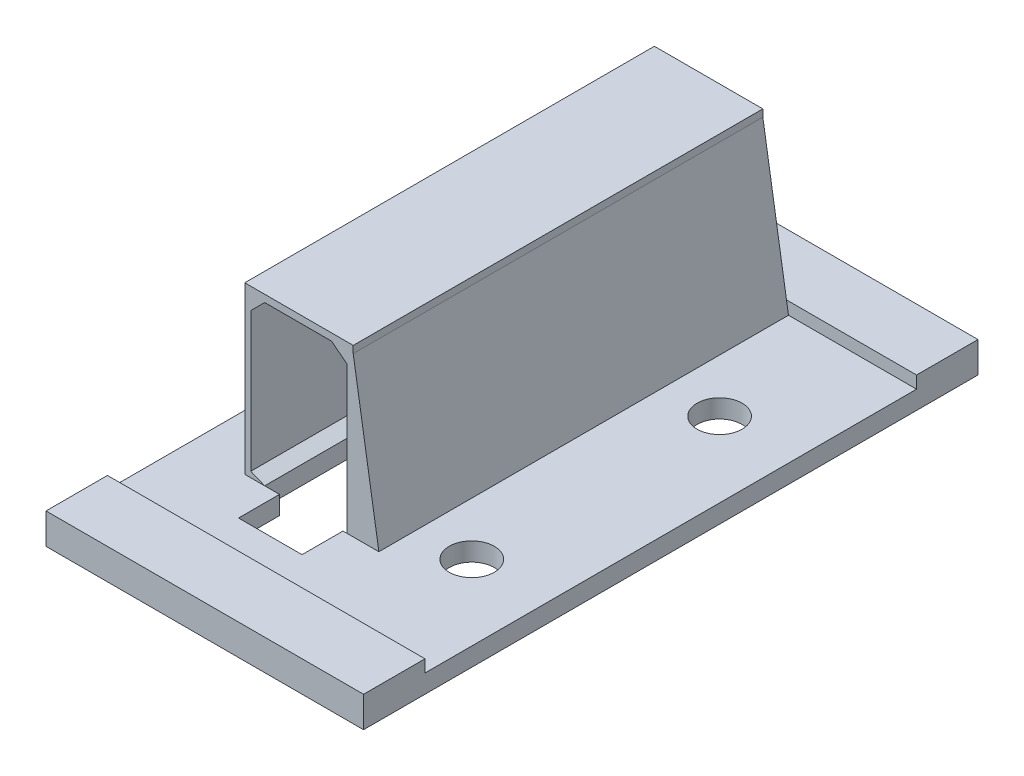
ISO-10303-21;
HEADER;
FILE_DESCRIPTION(('STEP AP214'),'2;1');
FILE_NAME('part.step','',(''),(''),'','','');
FILE_SCHEMA(('AUTOMOTIVE_DESIGN { 1 0 10303 214 1 1 1 1 }'));
ENDSEC;
DATA;
#1=APPLICATION_CONTEXT('core data for automotive mechanical design processes');
#2=APPLICATION_PROTOCOL_DEFINITION('international standard','automotive_design',2000,#1);
#3=PRODUCT_CONTEXT('',#1,'mechanical');
#4=PRODUCT('Part','Part','',(#3));
#5=PRODUCT_RELATED_PRODUCT_CATEGORY('part','',(#4));
#6=PRODUCT_DEFINITION_FORMATION('','',#4);
#7=PRODUCT_DEFINITION_CONTEXT('part definition',#1,'design');
#8=PRODUCT_DEFINITION('design','',#6,#7);
#9=PRODUCT_DEFINITION_SHAPE('','',#8);
#10=(LENGTH_UNIT() NAMED_UNIT(*) SI_UNIT(.MILLI.,.METRE.));
#11=(NAMED_UNIT(*) PLANE_ANGLE_UNIT() SI_UNIT($,.RADIAN.));
#12=(NAMED_UNIT(*) SI_UNIT($,.STERADIAN.) SOLID_ANGLE_UNIT());
#13=UNCERTAINTY_MEASURE_WITH_UNIT(LENGTH_MEASURE(1.E-05),#10,'distance_accuracy_value','');
#14=(GEOMETRIC_REPRESENTATION_CONTEXT(3) GLOBAL_UNCERTAINTY_ASSIGNED_CONTEXT((#13)) GLOBAL_UNIT_ASSIGNED_CONTEXT((#10,
#11,#12)) REPRESENTATION_CONTEXT('',''));
#15=CARTESIAN_POINT('',(0.,0.,0.));
#16=DIRECTION('',(0.,0.,1.));
#17=DIRECTION('',(1.,0.,0.));
#18=AXIS2_PLACEMENT_3D('',#15,#16,#17);
#19=CARTESIAN_POINT('',(17.4571997680022,22.1205755690432,2.75718042597652));
#20=DIRECTION('',(-0.619504091566,-0.784993427063555,0.));
#21=DIRECTION('',(0.784993427063555,-0.619504091566,0.));
#22=AXIS2_PLACEMENT_3D('',#19,#20,#21);
#23=PLANE('',#22);
#24=DIRECTION('',(-0.784993427063555,0.619504091566,0.));
#25=VECTOR('',#24,1.);
#26=CARTESIAN_POINT('',(17.4571997680022,22.1205755690432,-21.59));
#27=LINE('',#26,#25);
#28=CARTESIAN_POINT('',(19.8260707858369,20.2511009500897,-21.59));
#29=VERTEX_POINT('',#28);
#30=CARTESIAN_POINT('',(19.5481129071256,20.4704608035712,-21.59));
#31=VERTEX_POINT('',#30);
#32=EDGE_CURVE('E98',#29,#31,#27,.T.);
#33=ORIENTED_EDGE('',*,*,#32,.T.);
#34=DIRECTION('',(0.,0.,1.));
#35=VECTOR('',#34,1.);
#36=CARTESIAN_POINT('',(19.5481129071256,20.4704608035712,2.75718042597652));
#37=LINE('',#36,#35);
#38=CARTESIAN_POINT('',(19.5481129071256,20.4704608035712,-17.78));
#39=VERTEX_POINT('',#38);
#40=EDGE_CURVE('E102',#31,#39,#37,.T.);
#41=ORIENTED_EDGE('',*,*,#40,.T.);
#42=DIRECTION('',(-0.784993427063555,0.619504091566,0.));
#43=VECTOR('',#42,1.);
#44=CARTESIAN_POINT('',(17.4571997680022,22.1205755690432,-17.78));
#45=LINE('',#44,#43);
#46=CARTESIAN_POINT('',(17.6467317503519,21.971,-17.78));
#47=VERTEX_POINT('',#46);
#48=EDGE_CURVE('E332',#39,#47,#45,.T.);
#49=ORIENTED_EDGE('',*,*,#48,.T.);
#50=DIRECTION('',(0.,0.,-1.));
#51=VECTOR('',#50,1.);
#52=CARTESIAN_POINT('',(17.6467317503519,21.971,2.75718042597652));
#53=LINE('',#52,#51);
#54=CARTESIAN_POINT('',(17.6467317503519,21.971,-67.818));
#55=VERTEX_POINT('',#54);
#56=EDGE_CURVE('E331',#47,#55,#53,.T.);
#57=ORIENTED_EDGE('',*,*,#56,.T.);
#58=DIRECTION('',(0.784993427063555,-0.619504091566,0.));
#59=VECTOR('',#58,1.);
#60=CARTESIAN_POINT('',(17.4571997680022,22.1205755690432,-67.818));
#61=LINE('',#60,#59);
#62=CARTESIAN_POINT('',(19.8260707858369,20.2511009500897,-67.818));
#63=VERTEX_POINT('',#62);
#64=EDGE_CURVE('E345',#55,#63,#61,.T.);
#65=ORIENTED_EDGE('',*,*,#64,.T.);
#66=DIRECTION('',(0.,0.,-1.));
#67=VECTOR('',#66,1.);
#68=CARTESIAN_POINT('',(19.8260707858369,20.2511009500897,2.75718042597652));
#69=LINE('',#68,#67);
#70=EDGE_CURVE('E340',#29,#63,#69,.T.);
#71=ORIENTED_EDGE('',*,*,#70,.F.);
#72=EDGE_LOOP('',(#33,#41,#49,#57,#65,#71));
#73=FACE_BOUND('',#72,.T.);
#74=ADVANCED_FACE('F83',(#73),#23,.T.);
#75=CARTESIAN_POINT('',(1.99059559761719,-4.87832590559546,2.75718042597652));
#76=DIRECTION('',(0.377806240827101,-0.925884682016122,0.));
#77=DIRECTION('',(0.925884682016122,0.377806240827101,0.));
#78=AXIS2_PLACEMENT_3D('',#75,#76,#77);
#79=PLANE('',#78);
#80=DIRECTION('',(-0.925884682016122,-0.377806240827101,0.));
#81=VECTOR('',#80,1.);
#82=CARTESIAN_POINT('',(1.99059559761719,-4.87832590559546,-21.59));
#83=LINE('',#82,#81);
#84=CARTESIAN_POINT('',(22.5326450406693,3.50383510182555,-21.59));
#85=VERTEX_POINT('',#84);
#86=CARTESIAN_POINT('',(19.5481129071256,2.286,-21.59));
#87=VERTEX_POINT('',#86);
#88=EDGE_CURVE('E322',#85,#87,#83,.T.);
#89=ORIENTED_EDGE('',*,*,#88,.F.);
#90=DIRECTION('',(0.,0.,-1.));
#91=VECTOR('',#90,1.);
#92=CARTESIAN_POINT('',(22.5326450406693,3.50383510182555,2.75718042597652));
#93=LINE('',#92,#91);
#94=CARTESIAN_POINT('',(22.5326450406693,3.50383510182555,-67.818));
#95=VERTEX_POINT('',#94);
#96=EDGE_CURVE('E338',#85,#95,#93,.T.);
#97=ORIENTED_EDGE('',*,*,#96,.T.);
#98=DIRECTION('',(0.925884682016122,0.377806240827101,0.));
#99=VECTOR('',#98,1.);
#100=CARTESIAN_POINT('',(1.99059559761719,-4.87832590559546,-67.818));
#101=LINE('',#100,#99);
#102=CARTESIAN_POINT('',(19.5481129071256,2.286,-67.818));
#103=VERTEX_POINT('',#102);
#104=EDGE_CURVE('E348',#103,#95,#101,.T.);
#105=ORIENTED_EDGE('',*,*,#104,.F.);
#106=DIRECTION('',(0.,0.,-1.));
#107=VECTOR('',#106,1.);
#108=CARTESIAN_POINT('',(19.5481129071256,2.286,2.75718042597652));
#109=LINE('',#108,#107);
#110=EDGE_CURVE('E282',#87,#103,#109,.T.);
#111=ORIENTED_EDGE('',*,*,#110,.F.);
#112=EDGE_LOOP('',(#89,#97,#105,#111));
#113=FACE_BOUND('',#112,.T.);
#114=ADVANCED_FACE('F620',(#113),#79,.F.);
#115=CARTESIAN_POINT('',(22.5109525024363,3.63806038829697,2.75718042597652));
#116=DIRECTION('',(-0.987191011527884,-0.159542805411442,0.));
#117=DIRECTION('',(0.159542805411442,-0.987191011527884,0.));
#118=AXIS2_PLACEMENT_3D('',#115,#116,#117);
#119=PLANE('',#118);
#120=ORIENTED_EDGE('',*,*,#96,.F.);
#121=DIRECTION('',(-0.159542805411442,0.987191011527884,0.));
#122=VECTOR('',#121,1.);
#123=CARTESIAN_POINT('',(22.5109525024363,3.63806038829697,-21.59));
#124=LINE('',#123,#122);
#125=EDGE_CURVE('E91',#85,#29,#124,.T.);
#126=ORIENTED_EDGE('',*,*,#125,.T.);
#127=ORIENTED_EDGE('',*,*,#70,.T.);
#128=DIRECTION('',(-0.159542805411442,0.987191011527884,0.));
#129=VECTOR('',#128,1.);
#130=CARTESIAN_POINT('',(22.5109525024363,3.63806038829697,-67.818));
#131=LINE('',#130,#129);
#132=EDGE_CURVE('E369',#95,#63,#131,.T.);
#133=ORIENTED_EDGE('',*,*,#132,.F.);
#134=EDGE_LOOP('',(#120,#126,#127,#133));
#135=FACE_BOUND('',#134,.T.);
#136=ADVANCED_FACE('F473',(#135),#119,.T.);
#137=CARTESIAN_POINT('',(0.,0.,-67.818));
#138=DIRECTION('',(0.,0.,1.));
#139=DIRECTION('',(1.,0.,0.));
#140=AXIS2_PLACEMENT_3D('',#137,#138,#139);
#141=PLANE('',#140);
#142=ORIENTED_EDGE('',*,*,#64,.F.);
#143=DIRECTION('',(-1.,0.,0.));
#144=VECTOR('',#143,1.);
#145=CARTESIAN_POINT('',(0.,21.971,-67.818));
#146=LINE('',#145,#144);
#147=CARTESIAN_POINT('',(9.33989904991033,21.971,-67.818));
#148=VERTEX_POINT('',#147);
#149=EDGE_CURVE('E372',#55,#148,#146,.T.);
#150=ORIENTED_EDGE('',*,*,#149,.T.);
#151=DIRECTION('',(-0.707106781186547,-0.707106781186548,0.));
#152=VECTOR('',#151,1.);
#153=CARTESIAN_POINT('',(-6.31555047504482,6.3155504750448,-67.818));
#154=LINE('',#153,#152);
#155=CARTESIAN_POINT('',(7.62,20.2511009500897,-67.818));
#156=VERTEX_POINT('',#155);
#157=EDGE_CURVE('E467',#148,#156,#154,.T.);
#158=ORIENTED_EDGE('',*,*,#157,.T.);
#159=DIRECTION('',(0.,-1.,0.));
#160=VECTOR('',#159,1.);
#161=CARTESIAN_POINT('',(7.62,0.,-67.818));
#162=LINE('',#161,#160);
#163=CARTESIAN_POINT('',(7.62,2.98989904991031,-67.818));
#164=VERTEX_POINT('',#163);
#165=EDGE_CURVE('E374',#156,#164,#162,.T.);
#166=ORIENTED_EDGE('',*,*,#165,.T.);
#167=DIRECTION('',(0.925489621647092,-0.378772966595456,0.));
#168=VECTOR('',#167,1.);
#169=CARTESIAN_POINT('',(2.1413439329422,5.23213576757605,-67.818));
#170=LINE('',#169,#168);
#171=CARTESIAN_POINT('',(9.33989904991033,2.286,-67.818));
#172=VERTEX_POINT('',#171);
#173=EDGE_CURVE('E354',#164,#172,#170,.T.);
#174=ORIENTED_EDGE('',*,*,#173,.T.);
#175=DIRECTION('',(0.,1.,0.));
#176=VECTOR('',#175,1.);
#177=CARTESIAN_POINT('',(9.33989904991033,0.,-67.818));
#178=LINE('',#177,#176);
#179=CARTESIAN_POINT('',(9.33989904991033,0.,-67.818));
#180=VERTEX_POINT('',#179);
#181=EDGE_CURVE('E286',#180,#172,#178,.T.);
#182=ORIENTED_EDGE('',*,*,#181,.F.);
#183=DIRECTION('',(-1.,0.,0.));
#184=VECTOR('',#183,1.);
#185=CARTESIAN_POINT('',(19.5481129071256,0.,-67.818));
#186=LINE('',#185,#184);
#187=CARTESIAN_POINT('',(19.5481129071256,0.,-67.818));
#188=VERTEX_POINT('',#187);
#189=EDGE_CURVE('E290',#188,#180,#186,.T.);
#190=ORIENTED_EDGE('',*,*,#189,.F.);
#191=DIRECTION('',(0.,1.,0.));
#192=VECTOR('',#191,1.);
#193=CARTESIAN_POINT('',(19.5481129071256,0.,-67.818));
#194=LINE('',#193,#192);
#195=EDGE_CURVE('E275',#188,#103,#194,.T.);
#196=ORIENTED_EDGE('',*,*,#195,.T.);
#197=ORIENTED_EDGE('',*,*,#104,.T.);
#198=ORIENTED_EDGE('',*,*,#132,.T.);
#199=EDGE_LOOP('',(#142,#150,#158,#166,#174,#182,#190,#196,#197,#198));
#200=FACE_BOUND('',#199,.T.);
#201=ADVANCED_FACE('F291',(#200),#141,.T.);
#202=CARTESIAN_POINT('',(0.,2.286,0.));
#203=DIRECTION('',(0.,1.,0.));
#204=DIRECTION('',(0.,0.,1.));
#205=AXIS2_PLACEMENT_3D('',#202,#203,#204);
#206=PLANE('',#205);
#207=DIRECTION('',(1.,0.,0.));
#208=VECTOR('',#207,1.);
#209=CARTESIAN_POINT('',(9.33989904991033,2.286,-17.78));
#210=LINE('',#209,#208);
#211=CARTESIAN_POINT('',(9.33989904991033,2.286,-17.78));
#212=VERTEX_POINT('',#211);
#213=CARTESIAN_POINT('',(11.176,2.286,-17.78));
#214=VERTEX_POINT('',#213);
#215=EDGE_CURVE('E302',#212,#214,#210,.T.);
#216=ORIENTED_EDGE('',*,*,#215,.F.);
#217=DIRECTION('',(1.,0.,0.));
#218=VECTOR('',#217,1.);
#219=CARTESIAN_POINT('',(0.,2.286,-17.78));
#220=LINE('',#219,#218);
#221=CARTESIAN_POINT('',(6.87000000000001,2.286,-17.78));
#222=VERTEX_POINT('',#221);
#223=EDGE_CURVE('E464',#222,#212,#220,.T.);
#224=ORIENTED_EDGE('',*,*,#223,.F.);
#225=DIRECTION('',(0.,0.,-1.));
#226=VECTOR('',#225,1.);
#227=CARTESIAN_POINT('',(6.87000000000001,2.286,0.));
#228=LINE('',#227,#226);
#229=CARTESIAN_POINT('',(6.87,2.286,-68.58));
#230=VERTEX_POINT('',#229);
#231=EDGE_CURVE('E409',#222,#230,#228,.T.);
#232=ORIENTED_EDGE('',*,*,#231,.T.);
#233=DIRECTION('',(-1.,0.,0.));
#234=VECTOR('',#233,1.);
#235=CARTESIAN_POINT('',(0.,2.286,-68.58));
#236=LINE('',#235,#234);
#237=CARTESIAN_POINT('',(0.,2.286,-68.58));
#238=VERTEX_POINT('',#237);
#239=EDGE_CURVE('E453',#230,#238,#236,.T.);
#240=ORIENTED_EDGE('',*,*,#239,.T.);
#241=DIRECTION('',(0.,0.,-1.));
#242=VECTOR('',#241,1.);
#243=CARTESIAN_POINT('',(0.,2.286,0.));
#244=LINE('',#243,#242);
#245=CARTESIAN_POINT('',(0.,2.286,-7.62));
#246=VERTEX_POINT('',#245);
#247=EDGE_CURVE('E565',#246,#238,#244,.T.);
#248=ORIENTED_EDGE('',*,*,#247,.F.);
#249=DIRECTION('',(-1.,0.,0.));
#250=VECTOR('',#249,1.);
#251=CARTESIAN_POINT('',(0.,2.286,-7.62));
#252=LINE('',#251,#250);
#253=CARTESIAN_POINT('',(39.3827,2.286,-7.62));
#254=VERTEX_POINT('',#253);
#255=EDGE_CURVE('E571',#254,#246,#252,.T.);
#256=ORIENTED_EDGE('',*,*,#255,.F.);
#257=DIRECTION('',(0.,0.,-1.));
#258=VECTOR('',#257,1.);
#259=CARTESIAN_POINT('',(39.3827,2.286,0.));
#260=LINE('',#259,#258);
#261=CARTESIAN_POINT('',(39.3827,2.286,-68.58));
#262=VERTEX_POINT('',#261);
#263=EDGE_CURVE('E533',#254,#262,#260,.T.);
#264=ORIENTED_EDGE('',*,*,#263,.T.);
#265=CARTESIAN_POINT('',(23.50135,2.286,-68.58));
#266=VERTEX_POINT('',#265);
#267=EDGE_CURVE('E460',#262,#266,#236,.T.);
#268=ORIENTED_EDGE('',*,*,#267,.T.);
#269=DIRECTION('',(0.,0.,-1.));
#270=VECTOR('',#269,1.);
#271=CARTESIAN_POINT('',(23.50135,2.286,-67.818));
#272=LINE('',#271,#270);
#273=CARTESIAN_POINT('',(23.50135,2.286,-17.78));
#274=VERTEX_POINT('',#273);
#275=EDGE_CURVE('E377',#274,#266,#272,.T.);
#276=ORIENTED_EDGE('',*,*,#275,.F.);
#277=DIRECTION('',(1.,0.,0.));
#278=VECTOR('',#277,1.);
#279=CARTESIAN_POINT('',(0.,2.286,-17.78));
#280=LINE('',#279,#278);
#281=CARTESIAN_POINT('',(19.5481129071256,2.286,-17.78));
#282=VERTEX_POINT('',#281);
#283=EDGE_CURVE('E327',#282,#274,#280,.T.);
#284=ORIENTED_EDGE('',*,*,#283,.F.);
#285=CARTESIAN_POINT('',(19.05,2.286,-17.78));
#286=VERTEX_POINT('',#285);
#287=EDGE_CURVE('E304',#286,#282,#210,.T.);
#288=ORIENTED_EDGE('',*,*,#287,.F.);
#289=DIRECTION('',(0.,0.,-1.));
#290=VECTOR('',#289,1.);
#291=CARTESIAN_POINT('',(19.05,2.286,0.));
#292=LINE('',#291,#290);
#293=CARTESIAN_POINT('',(19.05,2.286,-12.7));
#294=VERTEX_POINT('',#293);
#295=EDGE_CURVE('E445',#294,#286,#292,.T.);
#296=ORIENTED_EDGE('',*,*,#295,.F.);
#297=DIRECTION('',(1.,0.,0.));
#298=VECTOR('',#297,1.);
#299=CARTESIAN_POINT('',(0.,2.286,-12.7));
#300=LINE('',#299,#298);
#301=CARTESIAN_POINT('',(11.176,2.286,-12.7));
#302=VERTEX_POINT('',#301);
#303=EDGE_CURVE('E448',#302,#294,#300,.T.);
#304=ORIENTED_EDGE('',*,*,#303,.F.);
#305=DIRECTION('',(0.,0.,1.));
#306=VECTOR('',#305,1.);
#307=CARTESIAN_POINT('',(11.176,2.286,0.));
#308=LINE('',#307,#306);
#309=EDGE_CURVE('E451',#214,#302,#308,.T.);
#310=ORIENTED_EDGE('',*,*,#309,.F.);
#311=EDGE_LOOP('',(#216,#224,#232,#240,#248,#256,#264,#268,#276,#284,#288,#296,#304,#310));
#312=FACE_BOUND('',#311,.T.);
#313=CARTESIAN_POINT('',(30.0679322618683,2.286,-53.467));
#314=DIRECTION('',(0.,1.,0.));
#315=DIRECTION('',(0.,0.,1.));
#316=AXIS2_PLACEMENT_3D('',#313,#314,#315);
#317=CIRCLE('',#316,2.794);
#318=CARTESIAN_POINT('',(30.0679322618683,2.286,-50.673));
#319=VERTEX_POINT('',#318);
#320=EDGE_CURVE('E441',#319,#319,#317,.T.);
#321=ORIENTED_EDGE('',*,*,#320,.F.);
#322=EDGE_LOOP('',(#321));
#323=FACE_BOUND('',#322,.T.);
#324=CARTESIAN_POINT('',(30.0679322618683,2.286,-22.733));
#325=DIRECTION('',(0.,1.,0.));
#326=DIRECTION('',(0.,0.,1.));
#327=AXIS2_PLACEMENT_3D('',#324,#325,#326);
#328=CIRCLE('',#327,2.79399999999999);
#329=CARTESIAN_POINT('',(30.0679322618683,2.286,-19.939));
#330=VERTEX_POINT('',#329);
#331=EDGE_CURVE('E438',#330,#330,#328,.T.);
#332=ORIENTED_EDGE('',*,*,#331,.F.);
#333=EDGE_LOOP('',(#332));
#334=FACE_BOUND('',#333,.T.);
#335=ADVANCED_FACE('F510',(#312,#323,#334),#206,.T.);
#336=CARTESIAN_POINT('',(0.,3.81,0.));
#337=DIRECTION('',(0.,1.,0.));
#338=DIRECTION('',(0.,0.,1.));
#339=AXIS2_PLACEMENT_3D('',#336,#337,#338);
#340=PLANE('',#339);
#341=DIRECTION('',(-1.,0.,0.));
#342=VECTOR('',#341,1.);
#343=CARTESIAN_POINT('',(0.,3.81,-68.58));
#344=LINE('',#343,#342);
#345=CARTESIAN_POINT('',(23.2550519354839,3.81,-68.58));
#346=VERTEX_POINT('',#345);
#347=CARTESIAN_POINT('',(6.87,3.81,-68.58));
#348=VERTEX_POINT('',#347);
#349=EDGE_CURVE('E416',#346,#348,#344,.T.);
#350=ORIENTED_EDGE('',*,*,#349,.F.);
#351=CARTESIAN_POINT('',(39.3827,3.81,-68.58));
#352=VERTEX_POINT('',#351);
#353=EDGE_CURVE('E412',#352,#346,#344,.T.);
#354=ORIENTED_EDGE('',*,*,#353,.F.);
#355=DIRECTION('',(0.,0.,-1.));
#356=VECTOR('',#355,1.);
#357=CARTESIAN_POINT('',(39.3827,3.81,0.));
#358=LINE('',#357,#356);
#359=CARTESIAN_POINT('',(39.3827,3.81,-76.2));
#360=VERTEX_POINT('',#359);
#361=EDGE_CURVE('E415',#352,#360,#358,.T.);
#362=ORIENTED_EDGE('',*,*,#361,.T.);
#363=DIRECTION('',(1.,0.,0.));
#364=VECTOR('',#363,1.);
#365=CARTESIAN_POINT('',(0.,3.81,-76.2));
#366=LINE('',#365,#364);
#367=CARTESIAN_POINT('',(0.,3.81,-76.2));
#368=VERTEX_POINT('',#367);
#369=EDGE_CURVE('E419',#368,#360,#366,.T.);
#370=ORIENTED_EDGE('',*,*,#369,.F.);
#371=DIRECTION('',(0.,0.,-1.));
#372=VECTOR('',#371,1.);
#373=CARTESIAN_POINT('',(0.,3.81,0.));
#374=LINE('',#373,#372);
#375=CARTESIAN_POINT('',(0.,3.81,-68.58));
#376=VERTEX_POINT('',#375);
#377=EDGE_CURVE('E422',#376,#368,#374,.T.);
#378=ORIENTED_EDGE('',*,*,#377,.F.);
#379=EDGE_CURVE('E417',#348,#376,#344,.T.);
#380=ORIENTED_EDGE('',*,*,#379,.F.);
#381=EDGE_LOOP('',(#350,#354,#362,#370,#378,#380));
#382=FACE_BOUND('',#381,.T.);
#383=ADVANCED_FACE('F660',(#382),#340,.T.);
#384=CARTESIAN_POINT('',(7.62000000000001,22.86,0.));
#385=DIRECTION('',(1.,0.,0.));
#386=DIRECTION('',(0.,0.,-1.));
#387=AXIS2_PLACEMENT_3D('',#384,#385,#386);
#388=PLANE('',#387);
#389=DIRECTION('',(0.,-1.,0.));
#390=VECTOR('',#389,1.);
#391=CARTESIAN_POINT('',(7.62000000000001,22.86,-17.78));
#392=LINE('',#391,#390);
#393=CARTESIAN_POINT('',(7.62,20.2511009500897,-17.78));
#394=VERTEX_POINT('',#393);
#395=CARTESIAN_POINT('',(7.62000000000001,2.98989904991031,-17.78));
#396=VERTEX_POINT('',#395);
#397=EDGE_CURVE('E407',#394,#396,#392,.T.);
#398=ORIENTED_EDGE('',*,*,#397,.T.);
#399=DIRECTION('',(0.,0.,-1.));
#400=VECTOR('',#399,1.);
#401=CARTESIAN_POINT('',(7.62,2.98989904991031,2.75718042597652));
#402=LINE('',#401,#400);
#403=EDGE_CURVE('E355',#396,#164,#402,.T.);
#404=ORIENTED_EDGE('',*,*,#403,.T.);
#405=ORIENTED_EDGE('',*,*,#165,.F.);
#406=DIRECTION('',(0.,0.,-1.));
#407=VECTOR('',#406,1.);
#408=CARTESIAN_POINT('',(7.62,20.2511009500897,2.75718042597652));
#409=LINE('',#408,#407);
#410=EDGE_CURVE('E360',#394,#156,#409,.T.);
#411=ORIENTED_EDGE('',*,*,#410,.F.);
#412=EDGE_LOOP('',(#398,#404,#405,#411));
#413=FACE_BOUND('',#412,.T.);
#414=ADVANCED_FACE('F497',(#413),#388,.T.);
#415=CARTESIAN_POINT('',(20.32,21.971,0.));
#416=DIRECTION('',(0.,1.,0.));
#417=DIRECTION('',(0.,0.,1.));
#418=AXIS2_PLACEMENT_3D('',#415,#416,#417);
#419=PLANE('',#418);
#420=ORIENTED_EDGE('',*,*,#149,.F.);
#421=ORIENTED_EDGE('',*,*,#56,.F.);
#422=DIRECTION('',(-1.,0.,0.));
#423=VECTOR('',#422,1.);
#424=CARTESIAN_POINT('',(20.32,21.971,-17.78));
#425=LINE('',#424,#423);
#426=CARTESIAN_POINT('',(9.33989904991033,21.971,-17.78));
#427=VERTEX_POINT('',#426);
#428=EDGE_CURVE('E391',#47,#427,#425,.T.);
#429=ORIENTED_EDGE('',*,*,#428,.T.);
#430=DIRECTION('',(0.,0.,-1.));
#431=VECTOR('',#430,1.);
#432=CARTESIAN_POINT('',(9.33989904991033,21.971,2.75718042597652));
#433=LINE('',#432,#431);
#434=EDGE_CURVE('E365',#427,#148,#433,.T.);
#435=ORIENTED_EDGE('',*,*,#434,.T.);
#436=EDGE_LOOP('',(#420,#421,#429,#435));
#437=FACE_BOUND('',#436,.T.);
#438=ADVANCED_FACE('F488',(#437),#419,.F.);
#439=CARTESIAN_POINT('',(0.,3.81,-68.58));
#440=DIRECTION('',(0.,0.,1.));
#441=DIRECTION('',(1.,0.,0.));
#442=AXIS2_PLACEMENT_3D('',#439,#440,#441);
#443=PLANE('',#442);
#444=ORIENTED_EDGE('',*,*,#353,.T.);
#445=DIRECTION('',(-0.159542805411442,0.987191011527884,0.));
#446=VECTOR('',#445,1.);
#447=CARTESIAN_POINT('',(23.2631920532206,3.75963200602048,-68.58));
#448=LINE('',#447,#446);
#449=EDGE_CURVE('E364',#266,#346,#448,.T.);
#450=ORIENTED_EDGE('',*,*,#449,.F.);
#451=ORIENTED_EDGE('',*,*,#267,.F.);
#452=DIRECTION('',(0.,-1.,0.));
#453=VECTOR('',#452,1.);
#454=CARTESIAN_POINT('',(39.3827,3.81,-68.58));
#455=LINE('',#454,#453);
#456=EDGE_CURVE('E436',#352,#262,#455,.T.);
#457=ORIENTED_EDGE('',*,*,#456,.F.);
#458=EDGE_LOOP('',(#444,#450,#451,#457));
#459=FACE_BOUND('',#458,.T.);
#460=ADVANCED_FACE('F646',(#459),#443,.T.);
#461=ORIENTED_EDGE('',*,*,#239,.F.);
#462=DIRECTION('',(0.,-1.,0.));
#463=VECTOR('',#462,1.);
#464=CARTESIAN_POINT('',(6.87,22.86,-68.58));
#465=LINE('',#464,#463);
#466=EDGE_CURVE('E403',#348,#230,#465,.T.);
#467=ORIENTED_EDGE('',*,*,#466,.F.);
#468=ORIENTED_EDGE('',*,*,#379,.T.);
#469=DIRECTION('',(0.,-1.,0.));
#470=VECTOR('',#469,1.);
#471=CARTESIAN_POINT('',(0.,3.81,-68.58));
#472=LINE('',#471,#470);
#473=EDGE_CURVE('E425',#376,#238,#472,.T.);
#474=ORIENTED_EDGE('',*,*,#473,.T.);
#475=EDGE_LOOP('',(#461,#467,#468,#474));
#476=FACE_BOUND('',#475,.T.);
#477=ADVANCED_FACE('F618',(#476),#443,.T.);
#478=CARTESIAN_POINT('',(39.3827,3.81,0.));
#479=DIRECTION('',(-1.,0.,0.));
#480=DIRECTION('',(0.,0.,1.));
#481=AXIS2_PLACEMENT_3D('',#478,#479,#480);
#482=PLANE('',#481);
#483=DIRECTION('',(0.,0.,-1.));
#484=VECTOR('',#483,1.);
#485=CARTESIAN_POINT('',(39.3827,0.,0.));
#486=LINE('',#485,#484);
#487=CARTESIAN_POINT('',(39.3827,0.,0.));
#488=VERTEX_POINT('',#487);
#489=CARTESIAN_POINT('',(39.3827,0.,-76.2));
#490=VERTEX_POINT('',#489);
#491=EDGE_CURVE('E535',#488,#490,#486,.T.);
#492=ORIENTED_EDGE('',*,*,#491,.T.);
#493=DIRECTION('',(0.,-1.,0.));
#494=VECTOR('',#493,1.);
#495=CARTESIAN_POINT('',(39.3827,3.81,-76.2));
#496=LINE('',#495,#494);
#497=EDGE_CURVE('E586',#360,#490,#496,.T.);
#498=ORIENTED_EDGE('',*,*,#497,.F.);
#499=ORIENTED_EDGE('',*,*,#361,.F.);
#500=ORIENTED_EDGE('',*,*,#456,.T.);
#501=ORIENTED_EDGE('',*,*,#263,.F.);
#502=DIRECTION('',(0.,-1.,0.));
#503=VECTOR('',#502,1.);
#504=CARTESIAN_POINT('',(39.3827,3.81,-7.62));
#505=LINE('',#504,#503);
#506=CARTESIAN_POINT('',(39.3827,3.81,-7.62));
#507=VERTEX_POINT('',#506);
#508=EDGE_CURVE('E468',#507,#254,#505,.T.);
#509=ORIENTED_EDGE('',*,*,#508,.F.);
#510=DIRECTION('',(0.,0.,-1.));
#511=VECTOR('',#510,1.);
#512=CARTESIAN_POINT('',(39.3827,3.81,0.));
#513=LINE('',#512,#511);
#514=CARTESIAN_POINT('',(39.3827,3.81,0.));
#515=VERTEX_POINT('',#514);
#516=EDGE_CURVE('E536',#515,#507,#513,.T.);
#517=ORIENTED_EDGE('',*,*,#516,.F.);
#518=DIRECTION('',(0.,-1.,0.));
#519=VECTOR('',#518,1.);
#520=CARTESIAN_POINT('',(39.3827,3.81,0.));
#521=LINE('',#520,#519);
#522=EDGE_CURVE('E547',#515,#488,#521,.T.);
#523=ORIENTED_EDGE('',*,*,#522,.T.);
#524=EDGE_LOOP('',(#492,#498,#499,#500,#501,#509,#517,#523));
#525=FACE_BOUND('',#524,.T.);
#526=ADVANCED_FACE('F85',(#525),#482,.F.);
#527=CARTESIAN_POINT('',(0.,3.81,-7.62));
#528=DIRECTION('',(0.,0.,1.));
#529=DIRECTION('',(1.,0.,0.));
#530=AXIS2_PLACEMENT_3D('',#527,#528,#529);
#531=PLANE('',#530);
#532=ORIENTED_EDGE('',*,*,#508,.T.);
#533=ORIENTED_EDGE('',*,*,#255,.T.);
#534=DIRECTION('',(0.,-1.,0.));
#535=VECTOR('',#534,1.);
#536=CARTESIAN_POINT('',(0.,3.81,-7.62));
#537=LINE('',#536,#535);
#538=CARTESIAN_POINT('',(0.,3.81,-7.62));
#539=VERTEX_POINT('',#538);
#540=EDGE_CURVE('E556',#539,#246,#537,.T.);
#541=ORIENTED_EDGE('',*,*,#540,.F.);
#542=DIRECTION('',(-1.,0.,0.));
#543=VECTOR('',#542,1.);
#544=CARTESIAN_POINT('',(0.,3.81,-7.62));
#545=LINE('',#544,#543);
#546=EDGE_CURVE('E539',#507,#539,#545,.T.);
#547=ORIENTED_EDGE('',*,*,#546,.F.);
#548=EDGE_LOOP('',(#532,#533,#541,#547));
#549=FACE_BOUND('',#548,.T.);
#550=ADVANCED_FACE('F611',(#549),#531,.F.);
#551=CARTESIAN_POINT('',(0.,3.81,0.));
#552=DIRECTION('',(-1.,0.,0.));
#553=DIRECTION('',(0.,0.,1.));
#554=AXIS2_PLACEMENT_3D('',#551,#552,#553);
#555=PLANE('',#554);
#556=DIRECTION('',(0.,0.,-1.));
#557=VECTOR('',#556,1.);
#558=CARTESIAN_POINT('',(0.,0.,0.));
#559=LINE('',#558,#557);
#560=CARTESIAN_POINT('',(0.,0.,0.));
#561=VERTEX_POINT('',#560);
#562=CARTESIAN_POINT('',(0.,0.,-76.2));
#563=VERTEX_POINT('',#562);
#564=EDGE_CURVE('E549',#561,#563,#559,.T.);
#565=ORIENTED_EDGE('',*,*,#564,.F.);
#566=DIRECTION('',(0.,-1.,0.));
#567=VECTOR('',#566,1.);
#568=CARTESIAN_POINT('',(0.,3.81,0.));
#569=LINE('',#568,#567);
#570=CARTESIAN_POINT('',(0.,3.81,0.));
#571=VERTEX_POINT('',#570);
#572=EDGE_CURVE('E554',#571,#561,#569,.T.);
#573=ORIENTED_EDGE('',*,*,#572,.F.);
#574=DIRECTION('',(0.,0.,-1.));
#575=VECTOR('',#574,1.);
#576=CARTESIAN_POINT('',(0.,3.81,0.));
#577=LINE('',#576,#575);
#578=EDGE_CURVE('E542',#571,#539,#577,.T.);
#579=ORIENTED_EDGE('',*,*,#578,.T.);
#580=ORIENTED_EDGE('',*,*,#540,.T.);
#581=ORIENTED_EDGE('',*,*,#247,.T.);
#582=ORIENTED_EDGE('',*,*,#473,.F.);
#583=ORIENTED_EDGE('',*,*,#377,.T.);
#584=DIRECTION('',(0.,-1.,0.));
#585=VECTOR('',#584,1.);
#586=CARTESIAN_POINT('',(0.,3.81,-76.2));
#587=LINE('',#586,#585);
#588=EDGE_CURVE('E430',#368,#563,#587,.T.);
#589=ORIENTED_EDGE('',*,*,#588,.T.);
#590=EDGE_LOOP('',(#565,#573,#579,#580,#581,#582,#583,#589));
#591=FACE_BOUND('',#590,.T.);
#592=ADVANCED_FACE('F594',(#591),#555,.T.);
#593=CARTESIAN_POINT('',(0.,3.81,0.));
#594=DIRECTION('',(0.,0.,-1.));
#595=DIRECTION('',(-1.,0.,0.));
#596=AXIS2_PLACEMENT_3D('',#593,#594,#595);
#597=PLANE('',#596);
#598=DIRECTION('',(1.,0.,0.));
#599=VECTOR('',#598,1.);
#600=CARTESIAN_POINT('',(0.,0.,0.));
#601=LINE('',#600,#599);
#602=EDGE_CURVE('E540',#561,#488,#601,.T.);
#603=ORIENTED_EDGE('',*,*,#602,.T.);
#604=ORIENTED_EDGE('',*,*,#522,.F.);
#605=DIRECTION('',(1.,0.,0.));
#606=VECTOR('',#605,1.);
#607=CARTESIAN_POINT('',(0.,3.81,0.));
#608=LINE('',#607,#606);
#609=EDGE_CURVE('E545',#571,#515,#608,.T.);
#610=ORIENTED_EDGE('',*,*,#609,.F.);
#611=ORIENTED_EDGE('',*,*,#572,.T.);
#612=EDGE_LOOP('',(#603,#604,#610,#611));
#613=FACE_BOUND('',#612,.T.);
#614=ADVANCED_FACE('F604',(#613),#597,.F.);
#615=CARTESIAN_POINT('',(0.,3.81,0.));
#616=DIRECTION('',(0.,1.,0.));
#617=DIRECTION('',(0.,0.,1.));
#618=AXIS2_PLACEMENT_3D('',#615,#616,#617);
#619=PLANE('',#618);
#620=ORIENTED_EDGE('',*,*,#516,.T.);
#621=ORIENTED_EDGE('',*,*,#546,.T.);
#622=ORIENTED_EDGE('',*,*,#578,.F.);
#623=ORIENTED_EDGE('',*,*,#609,.T.);
#624=EDGE_LOOP('',(#620,#621,#622,#623));
#625=FACE_BOUND('',#624,.T.);
#626=ADVANCED_FACE('F607',(#625),#619,.T.);
#627=CARTESIAN_POINT('',(0.,0.,0.));
#628=DIRECTION('',(0.,1.,0.));
#629=DIRECTION('',(0.,0.,1.));
#630=AXIS2_PLACEMENT_3D('',#627,#628,#629);
#631=PLANE('',#630);
#632=DIRECTION('',(0.,0.,-1.));
#633=VECTOR('',#632,1.);
#634=CARTESIAN_POINT('',(19.05,0.,0.));
#635=LINE('',#634,#633);
#636=CARTESIAN_POINT('',(19.05,0.,-12.7));
#637=VERTEX_POINT('',#636);
#638=CARTESIAN_POINT('',(19.05,0.,-17.78));
#639=VERTEX_POINT('',#638);
#640=EDGE_CURVE('E527',#637,#639,#635,.T.);
#641=ORIENTED_EDGE('',*,*,#640,.T.);
#642=DIRECTION('',(1.,0.,0.));
#643=VECTOR('',#642,1.);
#644=CARTESIAN_POINT('',(9.33989904991033,0.,-17.78));
#645=LINE('',#644,#643);
#646=CARTESIAN_POINT('',(19.5481129071256,0.,-17.78));
#647=VERTEX_POINT('',#646);
#648=EDGE_CURVE('E301',#639,#647,#645,.T.);
#649=ORIENTED_EDGE('',*,*,#648,.T.);
#650=DIRECTION('',(0.,0.,-1.));
#651=VECTOR('',#650,1.);
#652=CARTESIAN_POINT('',(19.5481129071256,0.,-17.78));
#653=LINE('',#652,#651);
#654=EDGE_CURVE('E279',#647,#188,#653,.T.);
#655=ORIENTED_EDGE('',*,*,#654,.T.);
#656=ORIENTED_EDGE('',*,*,#189,.T.);
#657=DIRECTION('',(0.,0.,1.));
#658=VECTOR('',#657,1.);
#659=CARTESIAN_POINT('',(9.33989904991033,0.,-67.818));
#660=LINE('',#659,#658);
#661=CARTESIAN_POINT('',(9.33989904991033,0.,-17.78));
#662=VERTEX_POINT('',#661);
#663=EDGE_CURVE('E296',#180,#662,#660,.T.);
#664=ORIENTED_EDGE('',*,*,#663,.T.);
#665=CARTESIAN_POINT('',(11.176,0.,-17.78));
#666=VERTEX_POINT('',#665);
#667=EDGE_CURVE('E287',#662,#666,#645,.T.);
#668=ORIENTED_EDGE('',*,*,#667,.T.);
#669=DIRECTION('',(0.,0.,1.));
#670=VECTOR('',#669,1.);
#671=CARTESIAN_POINT('',(11.176,0.,0.));
#672=LINE('',#671,#670);
#673=CARTESIAN_POINT('',(11.176,0.,-12.7));
#674=VERTEX_POINT('',#673);
#675=EDGE_CURVE('E442',#666,#674,#672,.T.);
#676=ORIENTED_EDGE('',*,*,#675,.T.);
#677=DIRECTION('',(1.,0.,0.));
#678=VECTOR('',#677,1.);
#679=CARTESIAN_POINT('',(0.,0.,-12.7));
#680=LINE('',#679,#678);
#681=EDGE_CURVE('E525',#674,#637,#680,.T.);
#682=ORIENTED_EDGE('',*,*,#681,.T.);
#683=EDGE_LOOP('',(#641,#649,#655,#656,#664,#668,#676,#682));
#684=FACE_BOUND('',#683,.T.);
#685=ORIENTED_EDGE('',*,*,#491,.F.);
#686=ORIENTED_EDGE('',*,*,#602,.F.);
#687=ORIENTED_EDGE('',*,*,#564,.T.);
#688=DIRECTION('',(1.,0.,0.));
#689=VECTOR('',#688,1.);
#690=CARTESIAN_POINT('',(0.,0.,-76.2));
#691=LINE('',#690,#689);
#692=EDGE_CURVE('E411',#563,#490,#691,.T.);
#693=ORIENTED_EDGE('',*,*,#692,.T.);
#694=EDGE_LOOP('',(#685,#686,#687,#693));
#695=FACE_BOUND('',#694,.T.);
#696=CARTESIAN_POINT('',(30.0679322618683,0.,-22.733));
#697=DIRECTION('',(0.,1.,0.));
#698=DIRECTION('',(0.,0.,1.));
#699=AXIS2_PLACEMENT_3D('',#696,#697,#698);
#700=CIRCLE('',#699,2.79399999999999);
#701=CARTESIAN_POINT('',(30.0679322618683,0.,-19.939));
#702=VERTEX_POINT('',#701);
#703=EDGE_CURVE('E568',#702,#702,#700,.T.);
#704=ORIENTED_EDGE('',*,*,#703,.T.);
#705=EDGE_LOOP('',(#704));
#706=FACE_BOUND('',#705,.T.);
#707=CARTESIAN_POINT('',(30.0679322618683,0.,-53.467));
#708=DIRECTION('',(0.,1.,0.));
#709=DIRECTION('',(0.,0.,1.));
#710=AXIS2_PLACEMENT_3D('',#707,#708,#709);
#711=CIRCLE('',#710,2.794);
#712=CARTESIAN_POINT('',(30.0679322618683,0.,-50.673));
#713=VERTEX_POINT('',#712);
#714=EDGE_CURVE('E1074',#713,#713,#711,.T.);
#715=ORIENTED_EDGE('',*,*,#714,.T.);
#716=EDGE_LOOP('',(#715));
#717=FACE_BOUND('',#716,.T.);
#718=ADVANCED_FACE('F299',(#684,#695,#706,#717),#631,.F.);
#719=CARTESIAN_POINT('',(19.05,2.286,0.));
#720=DIRECTION('',(-1.,0.,0.));
#721=DIRECTION('',(0.,0.,1.));
#722=AXIS2_PLACEMENT_3D('',#719,#720,#721);
#723=PLANE('',#722);
#724=DIRECTION('',(0.,1.,0.));
#725=VECTOR('',#724,1.);
#726=CARTESIAN_POINT('',(19.05,2.286,-17.78));
#727=LINE('',#726,#725);
#728=EDGE_CURVE('E312',#639,#286,#727,.T.);
#729=ORIENTED_EDGE('',*,*,#728,.F.);
#730=ORIENTED_EDGE('',*,*,#640,.F.);
#731=DIRECTION('',(0.,-1.,0.));
#732=VECTOR('',#731,1.);
#733=CARTESIAN_POINT('',(19.05,2.286,-12.7));
#734=LINE('',#733,#732);
#735=EDGE_CURVE('E532',#294,#637,#734,.T.);
#736=ORIENTED_EDGE('',*,*,#735,.F.);
#737=ORIENTED_EDGE('',*,*,#295,.T.);
#738=EDGE_LOOP('',(#729,#730,#736,#737));
#739=FACE_BOUND('',#738,.T.);
#740=ADVANCED_FACE('F679',(#739),#723,.T.);
#741=CARTESIAN_POINT('',(0.,2.286,-12.7));
#742=DIRECTION('',(0.,0.,-1.));
#743=DIRECTION('',(-1.,0.,0.));
#744=AXIS2_PLACEMENT_3D('',#741,#742,#743);
#745=PLANE('',#744);
#746=ORIENTED_EDGE('',*,*,#681,.F.);
#747=DIRECTION('',(0.,-1.,0.));
#748=VECTOR('',#747,1.);
#749=CARTESIAN_POINT('',(11.176,2.286,-12.7));
#750=LINE('',#749,#748);
#751=EDGE_CURVE('E522',#302,#674,#750,.T.);
#752=ORIENTED_EDGE('',*,*,#751,.F.);
#753=ORIENTED_EDGE('',*,*,#303,.T.);
#754=ORIENTED_EDGE('',*,*,#735,.T.);
#755=EDGE_LOOP('',(#746,#752,#753,#754));
#756=FACE_BOUND('',#755,.T.);
#757=ADVANCED_FACE('F676',(#756),#745,.T.);
#758=CARTESIAN_POINT('',(11.176,2.286,0.));
#759=DIRECTION('',(1.,0.,0.));
#760=DIRECTION('',(0.,0.,-1.));
#761=AXIS2_PLACEMENT_3D('',#758,#759,#760);
#762=PLANE('',#761);
#763=DIRECTION('',(0.,-1.,0.));
#764=VECTOR('',#763,1.);
#765=CARTESIAN_POINT('',(11.176,2.286,-17.78));
#766=LINE('',#765,#764);
#767=EDGE_CURVE('E12',#214,#666,#766,.T.);
#768=ORIENTED_EDGE('',*,*,#767,.F.);
#769=ORIENTED_EDGE('',*,*,#309,.T.);
#770=ORIENTED_EDGE('',*,*,#751,.T.);
#771=ORIENTED_EDGE('',*,*,#675,.F.);
#772=EDGE_LOOP('',(#768,#769,#770,#771));
#773=FACE_BOUND('',#772,.T.);
#774=ADVANCED_FACE('F519',(#773),#762,.T.);
#775=CARTESIAN_POINT('',(30.0679322618683,2.286,-53.467));
#776=DIRECTION('',(0.,-1.,0.));
#777=DIRECTION('',(0.,0.,-1.));
#778=AXIS2_PLACEMENT_3D('',#775,#776,#777);
#779=CYLINDRICAL_SURFACE('',#778,2.794);
#780=ORIENTED_EDGE('',*,*,#320,.T.);
#781=EDGE_LOOP('',(#780));
#782=FACE_BOUND('',#781,.T.);
#783=ORIENTED_EDGE('',*,*,#714,.F.);
#784=EDGE_LOOP('',(#783));
#785=FACE_BOUND('',#784,.T.);
#786=ADVANCED_FACE('F675',(#782,#785),#779,.F.);
#787=CARTESIAN_POINT('',(30.0679322618683,2.286,-22.733));
#788=DIRECTION('',(0.,-1.,0.));
#789=DIRECTION('',(0.,0.,-1.));
#790=AXIS2_PLACEMENT_3D('',#787,#788,#789);
#791=CYLINDRICAL_SURFACE('',#790,2.79399999999999);
#792=ORIENTED_EDGE('',*,*,#331,.T.);
#793=EDGE_LOOP('',(#792));
#794=FACE_BOUND('',#793,.T.);
#795=ORIENTED_EDGE('',*,*,#703,.F.);
#796=EDGE_LOOP('',(#795));
#797=FACE_BOUND('',#796,.T.);
#798=ADVANCED_FACE('F668',(#794,#797),#791,.F.);
#799=CARTESIAN_POINT('',(0.,3.81,-76.2));
#800=DIRECTION('',(0.,0.,-1.));
#801=DIRECTION('',(-1.,0.,0.));
#802=AXIS2_PLACEMENT_3D('',#799,#800,#801);
#803=PLANE('',#802);
#804=ORIENTED_EDGE('',*,*,#692,.F.);
#805=ORIENTED_EDGE('',*,*,#588,.F.);
#806=ORIENTED_EDGE('',*,*,#369,.T.);
#807=ORIENTED_EDGE('',*,*,#497,.T.);
#808=EDGE_LOOP('',(#804,#805,#806,#807));
#809=FACE_BOUND('',#808,.T.);
#810=ADVANCED_FACE('F598',(#809),#803,.T.);
#811=CARTESIAN_POINT('',(0.,22.86,-17.78));
#812=DIRECTION('',(0.,0.,1.));
#813=DIRECTION('',(1.,0.,0.));
#814=AXIS2_PLACEMENT_3D('',#811,#812,#813);
#815=PLANE('',#814);
#816=ORIENTED_EDGE('',*,*,#283,.T.);
#817=DIRECTION('',(-0.159542805411442,0.987191011527884,0.));
#818=VECTOR('',#817,1.);
#819=CARTESIAN_POINT('',(23.2631920532206,3.75963200602048,-17.78));
#820=LINE('',#819,#818);
#821=CARTESIAN_POINT('',(20.32,21.971,-17.78));
#822=VERTEX_POINT('',#821);
#823=EDGE_CURVE('E334',#274,#822,#820,.T.);
#824=ORIENTED_EDGE('',*,*,#823,.T.);
#825=DIRECTION('',(0.,-1.,0.));
#826=VECTOR('',#825,1.);
#827=CARTESIAN_POINT('',(20.32,0.,-17.78));
#828=LINE('',#827,#826);
#829=CARTESIAN_POINT('',(20.32,22.86,-17.78));
#830=VERTEX_POINT('',#829);
#831=EDGE_CURVE('E381',#830,#822,#828,.T.);
#832=ORIENTED_EDGE('',*,*,#831,.F.);
#833=DIRECTION('',(-1.,0.,0.));
#834=VECTOR('',#833,1.);
#835=CARTESIAN_POINT('',(0.,22.86,-17.78));
#836=LINE('',#835,#834);
#837=CARTESIAN_POINT('',(6.87000000000001,22.86,-17.78));
#838=VERTEX_POINT('',#837);
#839=EDGE_CURVE('E393',#830,#838,#836,.T.);
#840=ORIENTED_EDGE('',*,*,#839,.T.);
#841=DIRECTION('',(0.,-1.,0.));
#842=VECTOR('',#841,1.);
#843=CARTESIAN_POINT('',(6.87000000000001,22.86,-17.78));
#844=LINE('',#843,#842);
#845=EDGE_CURVE('E400',#838,#222,#844,.T.);
#846=ORIENTED_EDGE('',*,*,#845,.T.);
#847=ORIENTED_EDGE('',*,*,#223,.T.);
#848=DIRECTION('',(-0.925489621647092,0.378772966595456,0.));
#849=VECTOR('',#848,1.);
#850=CARTESIAN_POINT('',(2.1413439329422,5.23213576757605,-17.78));
#851=LINE('',#850,#849);
#852=EDGE_CURVE('E351',#212,#396,#851,.T.);
#853=ORIENTED_EDGE('',*,*,#852,.T.);
#854=ORIENTED_EDGE('',*,*,#397,.F.);
#855=DIRECTION('',(0.707106781186547,0.707106781186548,0.));
#856=VECTOR('',#855,1.);
#857=CARTESIAN_POINT('',(-6.31555047504482,6.3155504750448,-17.78));
#858=LINE('',#857,#856);
#859=EDGE_CURVE('E361',#394,#427,#858,.T.);
#860=ORIENTED_EDGE('',*,*,#859,.T.);
#861=ORIENTED_EDGE('',*,*,#428,.F.);
#862=ORIENTED_EDGE('',*,*,#48,.F.);
#863=DIRECTION('',(0.,-1.,0.));
#864=VECTOR('',#863,1.);
#865=CARTESIAN_POINT('',(19.5481129071256,0.,-17.78));
#866=LINE('',#865,#864);
#867=EDGE_CURVE('E319',#39,#282,#866,.T.);
#868=ORIENTED_EDGE('',*,*,#867,.T.);
#869=EDGE_LOOP('',(#816,#824,#832,#840,#846,#847,#853,#854,#860,#861,#862,#868));
#870=FACE_BOUND('',#869,.T.);
#871=ADVANCED_FACE('F481',(#870),#815,.T.);
#872=CARTESIAN_POINT('',(0.,22.86,-68.58));
#873=DIRECTION('',(0.,0.,1.));
#874=DIRECTION('',(1.,0.,0.));
#875=AXIS2_PLACEMENT_3D('',#872,#873,#874);
#876=PLANE('',#875);
#877=DIRECTION('',(0.,1.,0.));
#878=VECTOR('',#877,1.);
#879=CARTESIAN_POINT('',(20.32,0.,-68.58));
#880=LINE('',#879,#878);
#881=CARTESIAN_POINT('',(20.32,21.971,-68.58));
#882=VERTEX_POINT('',#881);
#883=CARTESIAN_POINT('',(20.32,22.86,-68.58));
#884=VERTEX_POINT('',#883);
#885=EDGE_CURVE('E385',#882,#884,#880,.T.);
#886=ORIENTED_EDGE('',*,*,#885,.F.);
#887=DIRECTION('',(-0.159542805411442,0.987191011527884,0.));
#888=VECTOR('',#887,1.);
#889=CARTESIAN_POINT('',(23.2631920532206,3.75963200602048,-68.58));
#890=LINE('',#889,#888);
#891=EDGE_CURVE('E328',#346,#882,#890,.T.);
#892=ORIENTED_EDGE('',*,*,#891,.F.);
#893=ORIENTED_EDGE('',*,*,#349,.T.);
#894=CARTESIAN_POINT('',(6.87,22.86,-68.58));
#895=VERTEX_POINT('',#894);
#896=EDGE_CURVE('E404',#895,#348,#465,.T.);
#897=ORIENTED_EDGE('',*,*,#896,.F.);
#898=DIRECTION('',(-1.,0.,0.));
#899=VECTOR('',#898,1.);
#900=CARTESIAN_POINT('',(0.,22.86,-68.58));
#901=LINE('',#900,#899);
#902=EDGE_CURVE('E396',#884,#895,#901,.T.);
#903=ORIENTED_EDGE('',*,*,#902,.F.);
#904=EDGE_LOOP('',(#886,#892,#893,#897,#903));
#905=FACE_BOUND('',#904,.T.);
#906=ADVANCED_FACE('F653',(#905),#876,.F.);
#907=CARTESIAN_POINT('',(6.87000000000001,22.86,0.));
#908=DIRECTION('',(1.,0.,0.));
#909=DIRECTION('',(0.,0.,-1.));
#910=AXIS2_PLACEMENT_3D('',#907,#908,#909);
#911=PLANE('',#910);
#912=ORIENTED_EDGE('',*,*,#231,.F.);
#913=ORIENTED_EDGE('',*,*,#845,.F.);
#914=DIRECTION('',(0.,0.,1.));
#915=VECTOR('',#914,1.);
#916=CARTESIAN_POINT('',(6.87000000000001,22.86,0.));
#917=LINE('',#916,#915);
#918=EDGE_CURVE('E398',#895,#838,#917,.T.);
#919=ORIENTED_EDGE('',*,*,#918,.F.);
#920=ORIENTED_EDGE('',*,*,#896,.T.);
#921=ORIENTED_EDGE('',*,*,#466,.T.);
#922=EDGE_LOOP('',(#912,#913,#919,#920,#921));
#923=FACE_BOUND('',#922,.T.);
#924=ADVANCED_FACE('F649',(#923),#911,.F.);
#925=CARTESIAN_POINT('',(0.,22.86,0.));
#926=DIRECTION('',(0.,1.,0.));
#927=DIRECTION('',(0.,0.,1.));
#928=AXIS2_PLACEMENT_3D('',#925,#926,#927);
#929=PLANE('',#928);
#930=ORIENTED_EDGE('',*,*,#839,.F.);
#931=DIRECTION('',(0.,0.,1.));
#932=VECTOR('',#931,1.);
#933=CARTESIAN_POINT('',(20.32,22.86,0.));
#934=LINE('',#933,#932);
#935=EDGE_CURVE('E388',#884,#830,#934,.T.);
#936=ORIENTED_EDGE('',*,*,#935,.F.);
#937=ORIENTED_EDGE('',*,*,#902,.T.);
#938=ORIENTED_EDGE('',*,*,#918,.T.);
#939=EDGE_LOOP('',(#930,#936,#937,#938));
#940=FACE_BOUND('',#939,.T.);
#941=ADVANCED_FACE('F642',(#940),#929,.T.);
#942=CARTESIAN_POINT('',(20.32,0.,0.));
#943=DIRECTION('',(1.,0.,0.));
#944=DIRECTION('',(0.,0.,-1.));
#945=AXIS2_PLACEMENT_3D('',#942,#943,#944);
#946=PLANE('',#945);
#947=ORIENTED_EDGE('',*,*,#831,.T.);
#948=DIRECTION('',(0.,0.,-1.));
#949=VECTOR('',#948,1.);
#950=CARTESIAN_POINT('',(20.32,21.971,0.));
#951=LINE('',#950,#949);
#952=EDGE_CURVE('E383',#822,#882,#951,.T.);
#953=ORIENTED_EDGE('',*,*,#952,.T.);
#954=ORIENTED_EDGE('',*,*,#885,.T.);
#955=ORIENTED_EDGE('',*,*,#935,.T.);
#956=EDGE_LOOP('',(#947,#953,#954,#955));
#957=FACE_BOUND('',#956,.T.);
#958=ADVANCED_FACE('F638',(#957),#946,.T.);
#959=CARTESIAN_POINT('',(23.2631920532206,3.75963200602048,-67.818));
#960=DIRECTION('',(-0.987191011527884,-0.159542805411442,0.));
#961=DIRECTION('',(0.159542805411442,-0.987191011527884,0.));
#962=AXIS2_PLACEMENT_3D('',#959,#960,#961);
#963=PLANE('',#962);
#964=ORIENTED_EDGE('',*,*,#449,.T.);
#965=ORIENTED_EDGE('',*,*,#891,.T.);
#966=ORIENTED_EDGE('',*,*,#952,.F.);
#967=ORIENTED_EDGE('',*,*,#823,.F.);
#968=ORIENTED_EDGE('',*,*,#275,.T.);
#969=EDGE_LOOP('',(#964,#965,#966,#967,#968));
#970=FACE_BOUND('',#969,.T.);
#971=ADVANCED_FACE('F633',(#970),#963,.F.);
#972=CARTESIAN_POINT('',(-6.31555047504482,6.3155504750448,2.75718042597652));
#973=DIRECTION('',(-0.707106781186548,0.707106781186547,0.));
#974=DIRECTION('',(-0.707106781186547,-0.707106781186548,0.));
#975=AXIS2_PLACEMENT_3D('',#972,#973,#974);
#976=PLANE('',#975);
#977=ORIENTED_EDGE('',*,*,#157,.F.);
#978=ORIENTED_EDGE('',*,*,#434,.F.);
#979=ORIENTED_EDGE('',*,*,#859,.F.);
#980=ORIENTED_EDGE('',*,*,#410,.T.);
#981=EDGE_LOOP('',(#977,#978,#979,#980));
#982=FACE_BOUND('',#981,.T.);
#983=ADVANCED_FACE('F493',(#982),#976,.F.);
#984=CARTESIAN_POINT('',(2.1413439329422,5.23213576757605,2.75718042597652));
#985=DIRECTION('',(-0.378772966595456,-0.925489621647092,0.));
#986=DIRECTION('',(0.925489621647092,-0.378772966595456,0.));
#987=AXIS2_PLACEMENT_3D('',#984,#985,#986);
#988=PLANE('',#987);
#989=ORIENTED_EDGE('',*,*,#173,.F.);
#990=ORIENTED_EDGE('',*,*,#403,.F.);
#991=ORIENTED_EDGE('',*,*,#852,.F.);
#992=DIRECTION('',(0.,0.,-1.));
#993=VECTOR('',#992,1.);
#994=CARTESIAN_POINT('',(9.33989904991033,2.286,2.75718042597652));
#995=LINE('',#994,#993);
#996=EDGE_CURVE('E350',#212,#172,#995,.T.);
#997=ORIENTED_EDGE('',*,*,#996,.T.);
#998=EDGE_LOOP('',(#989,#990,#991,#997));
#999=FACE_BOUND('',#998,.T.);
#1000=ADVANCED_FACE('F502',(#999),#988,.F.);
#1001=CARTESIAN_POINT('',(0.,0.,-21.59));
#1002=DIRECTION('',(0.,0.,1.));
#1003=DIRECTION('',(1.,0.,0.));
#1004=AXIS2_PLACEMENT_3D('',#1001,#1002,#1003);
#1005=PLANE('',#1004);
#1006=ORIENTED_EDGE('',*,*,#32,.F.);
#1007=ORIENTED_EDGE('',*,*,#125,.F.);
#1008=ORIENTED_EDGE('',*,*,#88,.T.);
#1009=DIRECTION('',(0.,-1.,0.));
#1010=VECTOR('',#1009,1.);
#1011=CARTESIAN_POINT('',(19.5481129071256,0.,-21.59));
#1012=LINE('',#1011,#1010);
#1013=EDGE_CURVE('E317',#31,#87,#1012,.T.);
#1014=ORIENTED_EDGE('',*,*,#1013,.F.);
#1015=EDGE_LOOP('',(#1006,#1007,#1008,#1014));
#1016=FACE_BOUND('',#1015,.T.);
#1017=ADVANCED_FACE('F477',(#1016),#1005,.F.);
#1018=CARTESIAN_POINT('',(19.5481129071256,0.,2.16041656592208));
#1019=DIRECTION('',(1.,0.,0.));
#1020=DIRECTION('',(0.,1.,0.));
#1021=AXIS2_PLACEMENT_3D('',#1018,#1019,#1020);
#1022=PLANE('',#1021);
#1023=ORIENTED_EDGE('',*,*,#40,.F.);
#1024=ORIENTED_EDGE('',*,*,#1013,.T.);
#1025=ORIENTED_EDGE('',*,*,#110,.T.);
#1026=ORIENTED_EDGE('',*,*,#195,.F.);
#1027=ORIENTED_EDGE('',*,*,#654,.F.);
#1028=DIRECTION('',(0.,1.,0.));
#1029=VECTOR('',#1028,1.);
#1030=CARTESIAN_POINT('',(19.5481129071256,0.,-17.78));
#1031=LINE('',#1030,#1029);
#1032=EDGE_CURVE('E310',#647,#282,#1031,.T.);
#1033=ORIENTED_EDGE('',*,*,#1032,.T.);
#1034=ORIENTED_EDGE('',*,*,#867,.F.);
#1035=EDGE_LOOP('',(#1023,#1024,#1025,#1026,#1027,#1033,#1034));
#1036=FACE_BOUND('',#1035,.T.);
#1037=ADVANCED_FACE('F277',(#1036),#1022,.F.);
#1038=CARTESIAN_POINT('',(9.33989904991033,0.,-17.78));
#1039=DIRECTION('',(0.,0.,1.));
#1040=DIRECTION('',(1.,0.,0.));
#1041=AXIS2_PLACEMENT_3D('',#1038,#1039,#1040);
#1042=PLANE('',#1041);
#1043=ORIENTED_EDGE('',*,*,#728,.T.);
#1044=ORIENTED_EDGE('',*,*,#287,.T.);
#1045=ORIENTED_EDGE('',*,*,#1032,.F.);
#1046=ORIENTED_EDGE('',*,*,#648,.F.);
#1047=EDGE_LOOP('',(#1043,#1044,#1045,#1046));
#1048=FACE_BOUND('',#1047,.T.);
#1049=ADVANCED_FACE('F780',(#1048),#1042,.F.);
#1050=ORIENTED_EDGE('',*,*,#767,.T.);
#1051=ORIENTED_EDGE('',*,*,#667,.F.);
#1052=DIRECTION('',(0.,1.,0.));
#1053=VECTOR('',#1052,1.);
#1054=CARTESIAN_POINT('',(9.33989904991033,0.,-17.78));
#1055=LINE('',#1054,#1053);
#1056=EDGE_CURVE('E313',#662,#212,#1055,.T.);
#1057=ORIENTED_EDGE('',*,*,#1056,.T.);
#1058=ORIENTED_EDGE('',*,*,#215,.T.);
#1059=EDGE_LOOP('',(#1050,#1051,#1057,#1058));
#1060=FACE_BOUND('',#1059,.T.);
#1061=ADVANCED_FACE('F516',(#1060),#1042,.F.);
#1062=CARTESIAN_POINT('',(9.33989904991033,0.,-67.818));
#1063=DIRECTION('',(-1.,0.,0.));
#1064=DIRECTION('',(0.,0.,1.));
#1065=AXIS2_PLACEMENT_3D('',#1062,#1063,#1064);
#1066=PLANE('',#1065);
#1067=ORIENTED_EDGE('',*,*,#996,.F.);
#1068=ORIENTED_EDGE('',*,*,#1056,.F.);
#1069=ORIENTED_EDGE('',*,*,#663,.F.);
#1070=ORIENTED_EDGE('',*,*,#181,.T.);
#1071=EDGE_LOOP('',(#1067,#1068,#1069,#1070));
#1072=FACE_BOUND('',#1071,.T.);
#1073=ADVANCED_FACE('F506',(#1072),#1066,.F.);
#1074=CLOSED_SHELL('',(#74,#114,#136,#201,#335,#383,#414,#438,#460,#477,#526,#550,#592,#614,
#626,#718,#740,#757,#774,#786,#798,#810,#871,#906,#924,#941,#958,#971,#983,#1000,#1017,#1037,
#1049,#1061,#1073));
#1075=MANIFOLD_SOLID_BREP('B2',#1074);
#1076=ADVANCED_BREP_SHAPE_REPRESENTATION('',(#18,#1075),#14);
#1077=SHAPE_DEFINITION_REPRESENTATION(#9,#1076);
ENDSEC;
END-ISO-10303-21;
